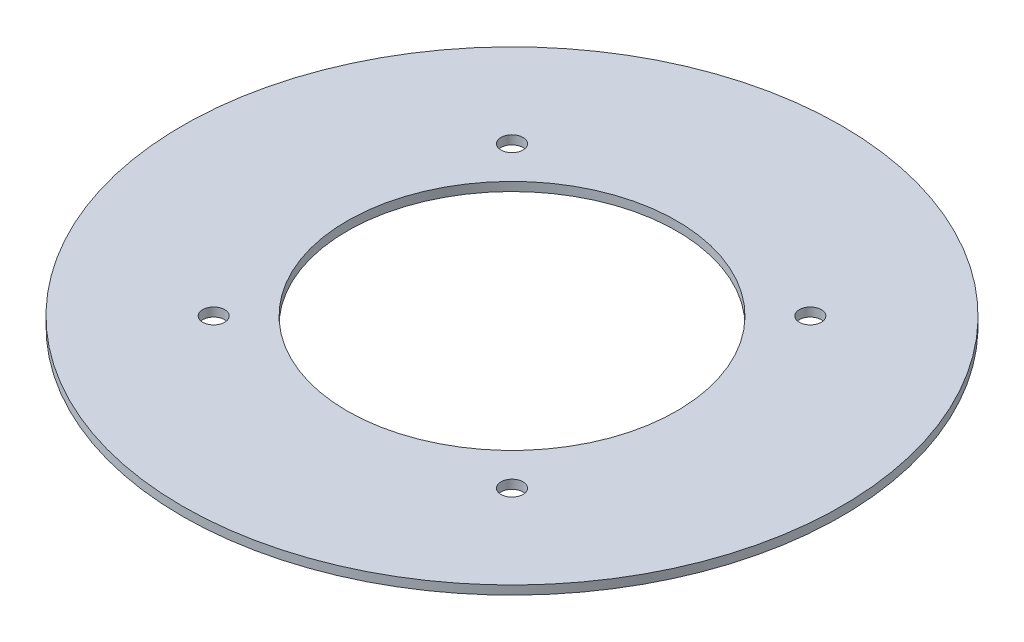
ISO-10303-21;
HEADER;
FILE_DESCRIPTION(('STEP AP214'),'2;1');
FILE_NAME('part.step','',(''),(''),'','','');
FILE_SCHEMA(('AUTOMOTIVE_DESIGN { 1 0 10303 214 1 1 1 1 }'));
ENDSEC;
DATA;
#1=APPLICATION_CONTEXT('core data for automotive mechanical design processes');
#2=APPLICATION_PROTOCOL_DEFINITION('international standard','automotive_design',2000,#1);
#3=PRODUCT_CONTEXT('',#1,'mechanical');
#4=PRODUCT('Part','Part','',(#3));
#5=PRODUCT_RELATED_PRODUCT_CATEGORY('part','',(#4));
#6=PRODUCT_DEFINITION_FORMATION('','',#4);
#7=PRODUCT_DEFINITION_CONTEXT('part definition',#1,'design');
#8=PRODUCT_DEFINITION('design','',#6,#7);
#9=PRODUCT_DEFINITION_SHAPE('','',#8);
#10=(LENGTH_UNIT() NAMED_UNIT(*) SI_UNIT(.MILLI.,.METRE.));
#11=(NAMED_UNIT(*) PLANE_ANGLE_UNIT() SI_UNIT($,.RADIAN.));
#12=(NAMED_UNIT(*) SI_UNIT($,.STERADIAN.) SOLID_ANGLE_UNIT());
#13=UNCERTAINTY_MEASURE_WITH_UNIT(LENGTH_MEASURE(1.E-05),#10,'distance_accuracy_value','');
#14=(GEOMETRIC_REPRESENTATION_CONTEXT(3) GLOBAL_UNCERTAINTY_ASSIGNED_CONTEXT((#13)) GLOBAL_UNIT_ASSIGNED_CONTEXT((#10,
#11,#12)) REPRESENTATION_CONTEXT('',''));
#15=CARTESIAN_POINT('',(0.,0.,0.));
#16=DIRECTION('',(0.,0.,1.));
#17=DIRECTION('',(1.,0.,0.));
#18=AXIS2_PLACEMENT_3D('',#15,#16,#17);
#19=CARTESIAN_POINT('',(0.,2.,0.));
#20=DIRECTION('',(0.,1.,0.));
#21=DIRECTION('',(0.,0.,1.));
#22=AXIS2_PLACEMENT_3D('',#19,#20,#21);
#23=PLANE('',#22);
#24=CARTESIAN_POINT('',(-33.941125496954,2.,33.9411254969546));
#25=DIRECTION('',(0.,1.,0.));
#26=DIRECTION('',(0.,0.,1.));
#27=AXIS2_PLACEMENT_3D('',#24,#25,#26);
#28=CIRCLE('',#27,2.5);
#29=CARTESIAN_POINT('',(-33.941125496954,2.,36.4411254969546));
#30=VERTEX_POINT('',#29);
#31=EDGE_CURVE('E74',#30,#30,#28,.T.);
#32=ORIENTED_EDGE('',*,*,#31,.F.);
#33=EDGE_LOOP('',(#32));
#34=FACE_BOUND('',#33,.T.);
#35=CARTESIAN_POINT('',(33.9411254969543,2.,33.9411254969542));
#36=DIRECTION('',(0.,1.,0.));
#37=DIRECTION('',(0.,0.,1.));
#38=AXIS2_PLACEMENT_3D('',#35,#36,#37);
#39=CIRCLE('',#38,2.5);
#40=CARTESIAN_POINT('',(33.9411254969543,2.,36.4411254969542));
#41=VERTEX_POINT('',#40);
#42=EDGE_CURVE('E77',#41,#41,#39,.T.);
#43=ORIENTED_EDGE('',*,*,#42,.F.);
#44=EDGE_LOOP('',(#43));
#45=FACE_BOUND('',#44,.T.);
#46=CARTESIAN_POINT('',(33.941125496954,2.,-33.9411254969546));
#47=DIRECTION('',(0.,1.,0.));
#48=DIRECTION('',(0.,0.,1.));
#49=AXIS2_PLACEMENT_3D('',#46,#47,#48);
#50=CIRCLE('',#49,2.5);
#51=CARTESIAN_POINT('',(33.941125496954,2.,-31.4411254969546));
#52=VERTEX_POINT('',#51);
#53=EDGE_CURVE('E73',#52,#52,#50,.T.);
#54=ORIENTED_EDGE('',*,*,#53,.F.);
#55=EDGE_LOOP('',(#54));
#56=FACE_BOUND('',#55,.T.);
#57=CARTESIAN_POINT('',(-33.9411254969543,2.,-33.9411254969542));
#58=DIRECTION('',(0.,1.,0.));
#59=DIRECTION('',(0.,0.,1.));
#60=AXIS2_PLACEMENT_3D('',#57,#58,#59);
#61=CIRCLE('',#60,2.5);
#62=CARTESIAN_POINT('',(-33.9411254969543,2.,-31.4411254969542));
#63=VERTEX_POINT('',#62);
#64=EDGE_CURVE('E55',#63,#63,#61,.T.);
#65=ORIENTED_EDGE('',*,*,#64,.F.);
#66=EDGE_LOOP('',(#65));
#67=FACE_BOUND('',#66,.T.);
#68=CARTESIAN_POINT('',(0.,2.,0.));
#69=DIRECTION('',(0.,1.,0.));
#70=DIRECTION('',(0.,0.,1.));
#71=AXIS2_PLACEMENT_3D('',#68,#69,#70);
#72=CIRCLE('',#71,75.);
#73=CARTESIAN_POINT('',(0.,2.,75.));
#74=VERTEX_POINT('',#73);
#75=EDGE_CURVE('E10',#74,#74,#72,.T.);
#76=ORIENTED_EDGE('',*,*,#75,.T.);
#77=EDGE_LOOP('',(#76));
#78=FACE_BOUND('',#77,.T.);
#79=CARTESIAN_POINT('',(0.,2.,0.));
#80=DIRECTION('',(0.,1.,0.));
#81=DIRECTION('',(0.,0.,1.));
#82=AXIS2_PLACEMENT_3D('',#79,#80,#81);
#83=CIRCLE('',#82,37.5);
#84=CARTESIAN_POINT('',(0.,2.,37.5));
#85=VERTEX_POINT('',#84);
#86=EDGE_CURVE('E45',#85,#85,#83,.T.);
#87=ORIENTED_EDGE('',*,*,#86,.F.);
#88=EDGE_LOOP('',(#87));
#89=FACE_BOUND('',#88,.T.);
#90=ADVANCED_FACE('F32',(#34,#45,#56,#67,#78,#89),#23,.T.);
#91=CARTESIAN_POINT('',(0.,0.,0.));
#92=DIRECTION('',(0.,1.,0.));
#93=DIRECTION('',(0.,0.,1.));
#94=AXIS2_PLACEMENT_3D('',#91,#92,#93);
#95=PLANE('',#94);
#96=CARTESIAN_POINT('',(-33.941125496954,0.,33.9411254969546));
#97=DIRECTION('',(0.,1.,0.));
#98=DIRECTION('',(0.,0.,1.));
#99=AXIS2_PLACEMENT_3D('',#96,#97,#98);
#100=CIRCLE('',#99,2.5);
#101=CARTESIAN_POINT('',(-33.941125496954,0.,36.4411254969546));
#102=VERTEX_POINT('',#101);
#103=EDGE_CURVE('E36',#102,#102,#100,.T.);
#104=ORIENTED_EDGE('',*,*,#103,.T.);
#105=EDGE_LOOP('',(#104));
#106=FACE_BOUND('',#105,.T.);
#107=CARTESIAN_POINT('',(33.9411254969543,0.,33.9411254969542));
#108=DIRECTION('',(0.,1.,0.));
#109=DIRECTION('',(0.,0.,1.));
#110=AXIS2_PLACEMENT_3D('',#107,#108,#109);
#111=CIRCLE('',#110,2.5);
#112=CARTESIAN_POINT('',(33.9411254969543,0.,36.4411254969542));
#113=VERTEX_POINT('',#112);
#114=EDGE_CURVE('E57',#113,#113,#111,.T.);
#115=ORIENTED_EDGE('',*,*,#114,.T.);
#116=EDGE_LOOP('',(#115));
#117=FACE_BOUND('',#116,.T.);
#118=CARTESIAN_POINT('',(33.941125496954,0.,-33.9411254969546));
#119=DIRECTION('',(0.,1.,0.));
#120=DIRECTION('',(0.,0.,1.));
#121=AXIS2_PLACEMENT_3D('',#118,#119,#120);
#122=CIRCLE('',#121,2.5);
#123=CARTESIAN_POINT('',(33.941125496954,0.,-31.4411254969546));
#124=VERTEX_POINT('',#123);
#125=EDGE_CURVE('E54',#124,#124,#122,.T.);
#126=ORIENTED_EDGE('',*,*,#125,.T.);
#127=EDGE_LOOP('',(#126));
#128=FACE_BOUND('',#127,.T.);
#129=CARTESIAN_POINT('',(-33.9411254969543,0.,-33.9411254969542));
#130=DIRECTION('',(0.,1.,0.));
#131=DIRECTION('',(0.,0.,1.));
#132=AXIS2_PLACEMENT_3D('',#129,#130,#131);
#133=CIRCLE('',#132,2.5);
#134=CARTESIAN_POINT('',(-33.9411254969543,0.,-31.4411254969542));
#135=VERTEX_POINT('',#134);
#136=EDGE_CURVE('E51',#135,#135,#133,.T.);
#137=ORIENTED_EDGE('',*,*,#136,.T.);
#138=EDGE_LOOP('',(#137));
#139=FACE_BOUND('',#138,.T.);
#140=CARTESIAN_POINT('',(0.,0.,0.));
#141=DIRECTION('',(0.,1.,0.));
#142=DIRECTION('',(0.,0.,1.));
#143=AXIS2_PLACEMENT_3D('',#140,#141,#142);
#144=CIRCLE('',#143,75.);
#145=CARTESIAN_POINT('',(0.,0.,75.));
#146=VERTEX_POINT('',#145);
#147=EDGE_CURVE('E40',#146,#146,#144,.T.);
#148=ORIENTED_EDGE('',*,*,#147,.F.);
#149=EDGE_LOOP('',(#148));
#150=FACE_BOUND('',#149,.T.);
#151=CARTESIAN_POINT('',(0.,0.,0.));
#152=DIRECTION('',(0.,1.,0.));
#153=DIRECTION('',(0.,0.,1.));
#154=AXIS2_PLACEMENT_3D('',#151,#152,#153);
#155=CIRCLE('',#154,37.5);
#156=CARTESIAN_POINT('',(0.,0.,37.5));
#157=VERTEX_POINT('',#156);
#158=EDGE_CURVE('E48',#157,#157,#155,.T.);
#159=ORIENTED_EDGE('',*,*,#158,.T.);
#160=EDGE_LOOP('',(#159));
#161=FACE_BOUND('',#160,.T.);
#162=ADVANCED_FACE('F88',(#106,#117,#128,#139,#150,#161),#95,.F.);
#163=CARTESIAN_POINT('',(0.,2.,0.));
#164=DIRECTION('',(0.,-1.,0.));
#165=DIRECTION('',(0.,0.,-1.));
#166=AXIS2_PLACEMENT_3D('',#163,#164,#165);
#167=CYLINDRICAL_SURFACE('',#166,75.);
#168=ORIENTED_EDGE('',*,*,#75,.F.);
#169=EDGE_LOOP('',(#168));
#170=FACE_BOUND('',#169,.T.);
#171=ORIENTED_EDGE('',*,*,#147,.T.);
#172=EDGE_LOOP('',(#171));
#173=FACE_BOUND('',#172,.T.);
#174=ADVANCED_FACE('F34',(#170,#173),#167,.T.);
#175=CARTESIAN_POINT('',(0.,2.,0.));
#176=DIRECTION('',(0.,-1.,0.));
#177=DIRECTION('',(0.,0.,-1.));
#178=AXIS2_PLACEMENT_3D('',#175,#176,#177);
#179=CYLINDRICAL_SURFACE('',#178,37.5);
#180=ORIENTED_EDGE('',*,*,#86,.T.);
#181=EDGE_LOOP('',(#180));
#182=FACE_BOUND('',#181,.T.);
#183=ORIENTED_EDGE('',*,*,#158,.F.);
#184=EDGE_LOOP('',(#183));
#185=FACE_BOUND('',#184,.T.);
#186=ADVANCED_FACE('F97',(#182,#185),#179,.F.);
#187=CARTESIAN_POINT('',(-33.9411254969543,-7.99999999999999,-33.9411254969542));
#188=DIRECTION('',(0.,1.,0.));
#189=DIRECTION('',(0.,0.,1.));
#190=AXIS2_PLACEMENT_3D('',#187,#188,#189);
#191=CYLINDRICAL_SURFACE('',#190,2.5);
#192=ORIENTED_EDGE('',*,*,#64,.T.);
#193=EDGE_LOOP('',(#192));
#194=FACE_BOUND('',#193,.T.);
#195=ORIENTED_EDGE('',*,*,#136,.F.);
#196=EDGE_LOOP('',(#195));
#197=FACE_BOUND('',#196,.T.);
#198=ADVANCED_FACE('F94',(#194,#197),#191,.F.);
#199=CARTESIAN_POINT('',(33.941125496954,-7.99999999999999,-33.9411254969546));
#200=DIRECTION('',(0.,1.,0.));
#201=DIRECTION('',(0.,0.,1.));
#202=AXIS2_PLACEMENT_3D('',#199,#200,#201);
#203=CYLINDRICAL_SURFACE('',#202,2.5);
#204=ORIENTED_EDGE('',*,*,#53,.T.);
#205=EDGE_LOOP('',(#204));
#206=FACE_BOUND('',#205,.T.);
#207=ORIENTED_EDGE('',*,*,#125,.F.);
#208=EDGE_LOOP('',(#207));
#209=FACE_BOUND('',#208,.T.);
#210=ADVANCED_FACE('F83',(#206,#209),#203,.F.);
#211=CARTESIAN_POINT('',(33.9411254969543,-7.99999999999999,33.9411254969542));
#212=DIRECTION('',(0.,1.,0.));
#213=DIRECTION('',(0.,0.,1.));
#214=AXIS2_PLACEMENT_3D('',#211,#212,#213);
#215=CYLINDRICAL_SURFACE('',#214,2.5);
#216=ORIENTED_EDGE('',*,*,#42,.T.);
#217=EDGE_LOOP('',(#216));
#218=FACE_BOUND('',#217,.T.);
#219=ORIENTED_EDGE('',*,*,#114,.F.);
#220=EDGE_LOOP('',(#219));
#221=FACE_BOUND('',#220,.T.);
#222=ADVANCED_FACE('F118',(#218,#221),#215,.F.);
#223=CARTESIAN_POINT('',(-33.941125496954,-7.99999999999999,33.9411254969546));
#224=DIRECTION('',(0.,1.,0.));
#225=DIRECTION('',(0.,0.,1.));
#226=AXIS2_PLACEMENT_3D('',#223,#224,#225);
#227=CYLINDRICAL_SURFACE('',#226,2.5);
#228=ORIENTED_EDGE('',*,*,#31,.T.);
#229=EDGE_LOOP('',(#228));
#230=FACE_BOUND('',#229,.T.);
#231=ORIENTED_EDGE('',*,*,#103,.F.);
#232=EDGE_LOOP('',(#231));
#233=FACE_BOUND('',#232,.T.);
#234=ADVANCED_FACE('F115',(#230,#233),#227,.F.);
#235=CLOSED_SHELL('',(#90,#162,#174,#186,#198,#210,#222,#234));
#236=MANIFOLD_SOLID_BREP('B2',#235);
#237=ADVANCED_BREP_SHAPE_REPRESENTATION('',(#18,#236),#14);
#238=SHAPE_DEFINITION_REPRESENTATION(#9,#237);
ENDSEC;
END-ISO-10303-21;
